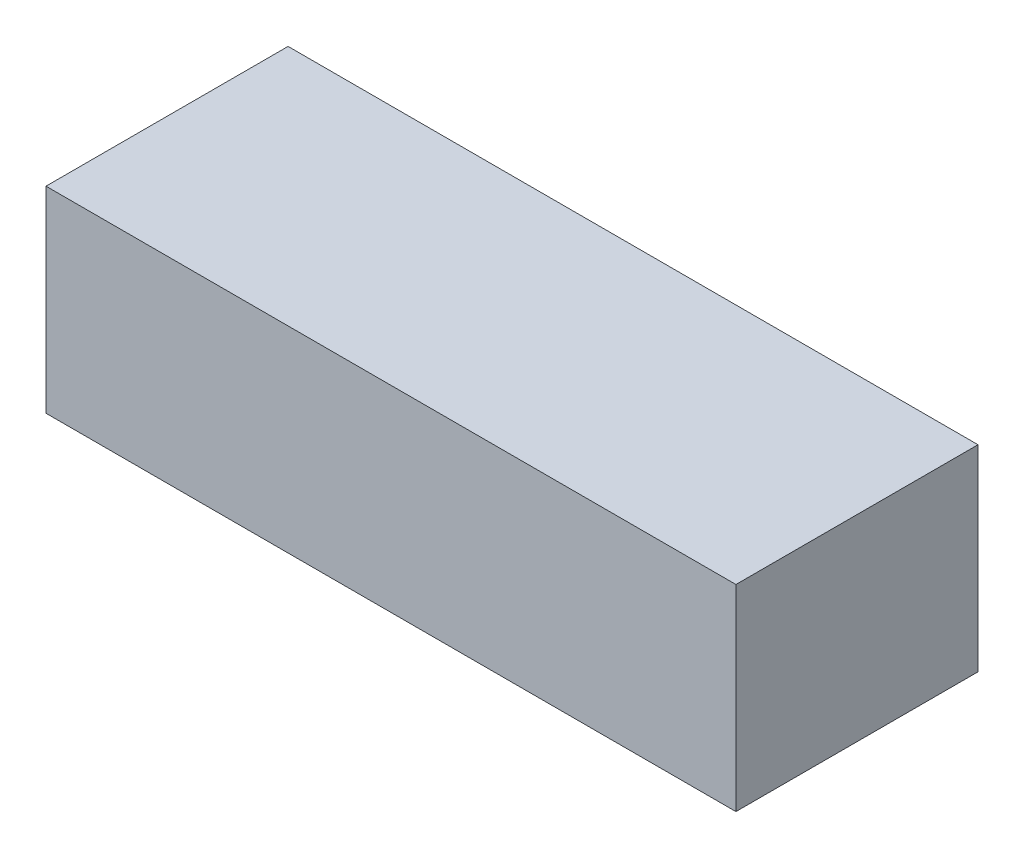
ISO-10303-21;
HEADER;
FILE_DESCRIPTION(('STEP AP214'),'2;1');
FILE_NAME('part.step','',(''),(''),'','','');
FILE_SCHEMA(('AUTOMOTIVE_DESIGN { 1 0 10303 214 1 1 1 1 }'));
ENDSEC;
DATA;
#1=APPLICATION_CONTEXT('core data for automotive mechanical design processes');
#2=APPLICATION_PROTOCOL_DEFINITION('international standard','automotive_design',2000,#1);
#3=PRODUCT_CONTEXT('',#1,'mechanical');
#4=PRODUCT('Part','Part','',(#3));
#5=PRODUCT_RELATED_PRODUCT_CATEGORY('part','',(#4));
#6=PRODUCT_DEFINITION_FORMATION('','',#4);
#7=PRODUCT_DEFINITION_CONTEXT('part definition',#1,'design');
#8=PRODUCT_DEFINITION('design','',#6,#7);
#9=PRODUCT_DEFINITION_SHAPE('','',#8);
#10=(LENGTH_UNIT() NAMED_UNIT(*) SI_UNIT(.MILLI.,.METRE.));
#11=(NAMED_UNIT(*) PLANE_ANGLE_UNIT() SI_UNIT($,.RADIAN.));
#12=(NAMED_UNIT(*) SI_UNIT($,.STERADIAN.) SOLID_ANGLE_UNIT());
#13=UNCERTAINTY_MEASURE_WITH_UNIT(LENGTH_MEASURE(1.E-05),#10,'distance_accuracy_value','');
#14=(GEOMETRIC_REPRESENTATION_CONTEXT(3) GLOBAL_UNCERTAINTY_ASSIGNED_CONTEXT((#13)) GLOBAL_UNIT_ASSIGNED_CONTEXT((#10,
#11,#12)) REPRESENTATION_CONTEXT('',''));
#15=CARTESIAN_POINT('',(0.,0.,0.));
#16=DIRECTION('',(0.,0.,1.));
#17=DIRECTION('',(1.,0.,0.));
#18=AXIS2_PLACEMENT_3D('',#15,#16,#17);
#19=CARTESIAN_POINT('',(0.,65.,0.));
#20=DIRECTION('',(1.,0.,0.));
#21=DIRECTION('',(0.,0.,-1.));
#22=AXIS2_PLACEMENT_3D('',#19,#20,#21);
#23=PLANE('',#22);
#24=DIRECTION('',(0.,0.,1.));
#25=VECTOR('',#24,1.);
#26=CARTESIAN_POINT('',(0.,0.,0.));
#27=LINE('',#26,#25);
#28=CARTESIAN_POINT('',(0.,0.,-80.));
#29=VERTEX_POINT('',#28);
#30=CARTESIAN_POINT('',(0.,0.,0.));
#31=VERTEX_POINT('',#30);
#32=EDGE_CURVE('E96',#29,#31,#27,.T.);
#33=ORIENTED_EDGE('',*,*,#32,.T.);
#34=DIRECTION('',(0.,-1.,0.));
#35=VECTOR('',#34,1.);
#36=CARTESIAN_POINT('',(0.,65.,0.));
#37=LINE('',#36,#35);
#38=CARTESIAN_POINT('',(0.,65.,0.));
#39=VERTEX_POINT('',#38);
#40=EDGE_CURVE('E11',#39,#31,#37,.T.);
#41=ORIENTED_EDGE('',*,*,#40,.F.);
#42=DIRECTION('',(0.,0.,1.));
#43=VECTOR('',#42,1.);
#44=CARTESIAN_POINT('',(0.,65.,0.));
#45=LINE('',#44,#43);
#46=CARTESIAN_POINT('',(0.,65.,-80.));
#47=VERTEX_POINT('',#46);
#48=EDGE_CURVE('E84',#47,#39,#45,.T.);
#49=ORIENTED_EDGE('',*,*,#48,.F.);
#50=DIRECTION('',(0.,-1.,0.));
#51=VECTOR('',#50,1.);
#52=CARTESIAN_POINT('',(0.,65.,-80.));
#53=LINE('',#52,#51);
#54=EDGE_CURVE('E92',#47,#29,#53,.T.);
#55=ORIENTED_EDGE('',*,*,#54,.T.);
#56=EDGE_LOOP('',(#33,#41,#49,#55));
#57=FACE_BOUND('',#56,.T.);
#58=ADVANCED_FACE('F33',(#57),#23,.F.);
#59=CARTESIAN_POINT('',(0.,65.,0.));
#60=DIRECTION('',(0.,0.,-1.));
#61=DIRECTION('',(-1.,0.,0.));
#62=AXIS2_PLACEMENT_3D('',#59,#60,#61);
#63=PLANE('',#62);
#64=DIRECTION('',(1.,0.,0.));
#65=VECTOR('',#64,1.);
#66=CARTESIAN_POINT('',(0.,0.,0.));
#67=LINE('',#66,#65);
#68=CARTESIAN_POINT('',(228.,0.,0.));
#69=VERTEX_POINT('',#68);
#70=EDGE_CURVE('E88',#31,#69,#67,.T.);
#71=ORIENTED_EDGE('',*,*,#70,.T.);
#72=DIRECTION('',(0.,-1.,0.));
#73=VECTOR('',#72,1.);
#74=CARTESIAN_POINT('',(228.,65.,0.));
#75=LINE('',#74,#73);
#76=CARTESIAN_POINT('',(228.,65.,0.));
#77=VERTEX_POINT('',#76);
#78=EDGE_CURVE('E41',#77,#69,#75,.T.);
#79=ORIENTED_EDGE('',*,*,#78,.F.);
#80=DIRECTION('',(1.,0.,0.));
#81=VECTOR('',#80,1.);
#82=CARTESIAN_POINT('',(0.,65.,0.));
#83=LINE('',#82,#81);
#84=EDGE_CURVE('E79',#39,#77,#83,.T.);
#85=ORIENTED_EDGE('',*,*,#84,.F.);
#86=ORIENTED_EDGE('',*,*,#40,.T.);
#87=EDGE_LOOP('',(#71,#79,#85,#86));
#88=FACE_BOUND('',#87,.T.);
#89=ADVANCED_FACE('F87',(#88),#63,.F.);
#90=CARTESIAN_POINT('',(228.,65.,0.));
#91=DIRECTION('',(-1.,0.,0.));
#92=DIRECTION('',(0.,0.,1.));
#93=AXIS2_PLACEMENT_3D('',#90,#91,#92);
#94=PLANE('',#93);
#95=DIRECTION('',(0.,0.,-1.));
#96=VECTOR('',#95,1.);
#97=CARTESIAN_POINT('',(228.,0.,0.));
#98=LINE('',#97,#96);
#99=CARTESIAN_POINT('',(228.,0.,-80.));
#100=VERTEX_POINT('',#99);
#101=EDGE_CURVE('E66',#69,#100,#98,.T.);
#102=ORIENTED_EDGE('',*,*,#101,.T.);
#103=DIRECTION('',(0.,-1.,0.));
#104=VECTOR('',#103,1.);
#105=CARTESIAN_POINT('',(228.,65.,-80.));
#106=LINE('',#105,#104);
#107=CARTESIAN_POINT('',(228.,65.,-80.));
#108=VERTEX_POINT('',#107);
#109=EDGE_CURVE('E89',#108,#100,#106,.T.);
#110=ORIENTED_EDGE('',*,*,#109,.F.);
#111=DIRECTION('',(0.,0.,-1.));
#112=VECTOR('',#111,1.);
#113=CARTESIAN_POINT('',(228.,65.,0.));
#114=LINE('',#113,#112);
#115=EDGE_CURVE('E82',#77,#108,#114,.T.);
#116=ORIENTED_EDGE('',*,*,#115,.F.);
#117=ORIENTED_EDGE('',*,*,#78,.T.);
#118=EDGE_LOOP('',(#102,#110,#116,#117));
#119=FACE_BOUND('',#118,.T.);
#120=ADVANCED_FACE('F90',(#119),#94,.F.);
#121=CARTESIAN_POINT('',(0.,65.,-80.));
#122=DIRECTION('',(0.,0.,1.));
#123=DIRECTION('',(1.,0.,0.));
#124=AXIS2_PLACEMENT_3D('',#121,#122,#123);
#125=PLANE('',#124);
#126=DIRECTION('',(-1.,0.,0.));
#127=VECTOR('',#126,1.);
#128=CARTESIAN_POINT('',(0.,0.,-80.));
#129=LINE('',#128,#127);
#130=EDGE_CURVE('E72',#100,#29,#129,.T.);
#131=ORIENTED_EDGE('',*,*,#130,.T.);
#132=ORIENTED_EDGE('',*,*,#54,.F.);
#133=DIRECTION('',(-1.,0.,0.));
#134=VECTOR('',#133,1.);
#135=CARTESIAN_POINT('',(0.,65.,-80.));
#136=LINE('',#135,#134);
#137=EDGE_CURVE('E49',#108,#47,#136,.T.);
#138=ORIENTED_EDGE('',*,*,#137,.F.);
#139=ORIENTED_EDGE('',*,*,#109,.T.);
#140=EDGE_LOOP('',(#131,#132,#138,#139));
#141=FACE_BOUND('',#140,.T.);
#142=ADVANCED_FACE('F103',(#141),#125,.F.);
#143=CARTESIAN_POINT('',(0.,65.,0.));
#144=DIRECTION('',(0.,-1.,0.));
#145=DIRECTION('',(0.,0.,-1.));
#146=AXIS2_PLACEMENT_3D('',#143,#144,#145);
#147=PLANE('',#146);
#148=ORIENTED_EDGE('',*,*,#48,.T.);
#149=ORIENTED_EDGE('',*,*,#84,.T.);
#150=ORIENTED_EDGE('',*,*,#115,.T.);
#151=ORIENTED_EDGE('',*,*,#137,.T.);
#152=EDGE_LOOP('',(#148,#149,#150,#151));
#153=FACE_BOUND('',#152,.T.);
#154=ADVANCED_FACE('F80',(#153),#147,.F.);
#155=CARTESIAN_POINT('',(0.,0.,0.));
#156=DIRECTION('',(0.,-1.,0.));
#157=DIRECTION('',(0.,0.,-1.));
#158=AXIS2_PLACEMENT_3D('',#155,#156,#157);
#159=PLANE('',#158);
#160=ORIENTED_EDGE('',*,*,#32,.F.);
#161=ORIENTED_EDGE('',*,*,#130,.F.);
#162=ORIENTED_EDGE('',*,*,#101,.F.);
#163=ORIENTED_EDGE('',*,*,#70,.F.);
#164=EDGE_LOOP('',(#160,#161,#162,#163));
#165=FACE_BOUND('',#164,.T.);
#166=ADVANCED_FACE('F106',(#165),#159,.T.);
#167=CLOSED_SHELL('',(#58,#89,#120,#142,#154,#166));
#168=MANIFOLD_SOLID_BREP('B2',#167);
#169=ADVANCED_BREP_SHAPE_REPRESENTATION('',(#18,#168),#14);
#170=SHAPE_DEFINITION_REPRESENTATION(#9,#169);
ENDSEC;
END-ISO-10303-21;
